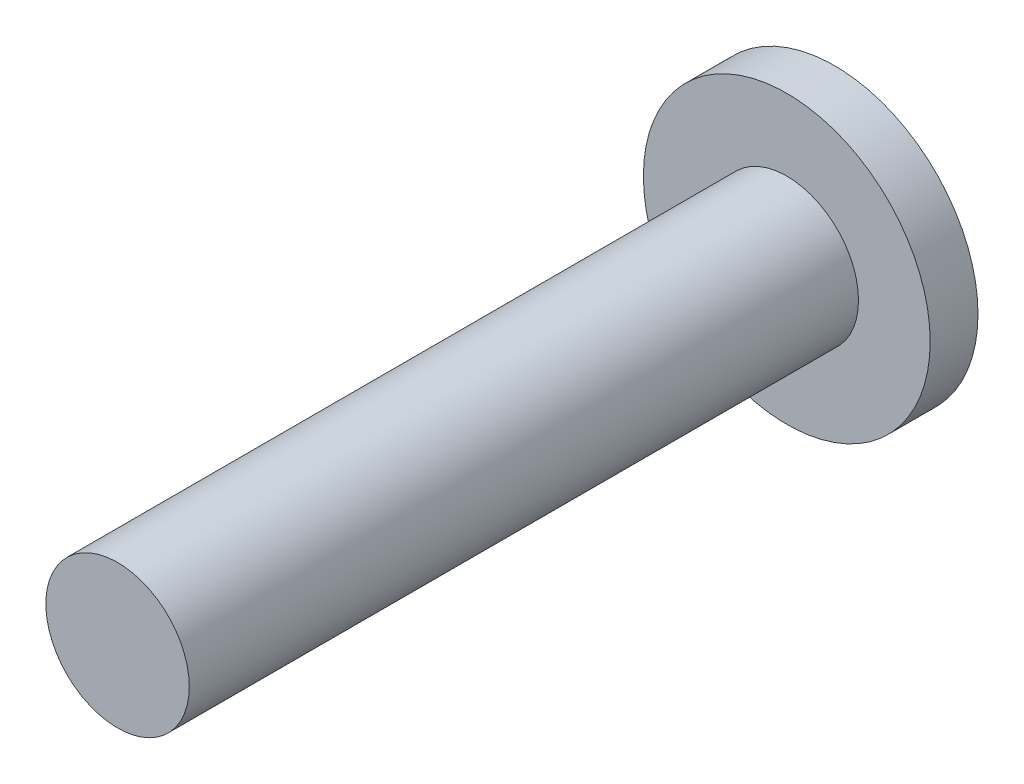
ISO-10303-21;
HEADER;
FILE_DESCRIPTION(('STEP AP214'),'2;1');
FILE_NAME('part.step','',(''),(''),'','','');
FILE_SCHEMA(('AUTOMOTIVE_DESIGN { 1 0 10303 214 1 1 1 1 }'));
ENDSEC;
DATA;
#1=APPLICATION_CONTEXT('core data for automotive mechanical design processes');
#2=APPLICATION_PROTOCOL_DEFINITION('international standard','automotive_design',2000,#1);
#3=PRODUCT_CONTEXT('',#1,'mechanical');
#4=PRODUCT('Part','Part','',(#3));
#5=PRODUCT_RELATED_PRODUCT_CATEGORY('part','',(#4));
#6=PRODUCT_DEFINITION_FORMATION('','',#4);
#7=PRODUCT_DEFINITION_CONTEXT('part definition',#1,'design');
#8=PRODUCT_DEFINITION('design','',#6,#7);
#9=PRODUCT_DEFINITION_SHAPE('','',#8);
#10=(LENGTH_UNIT() NAMED_UNIT(*) SI_UNIT(.MILLI.,.METRE.));
#11=(NAMED_UNIT(*) PLANE_ANGLE_UNIT() SI_UNIT($,.RADIAN.));
#12=(NAMED_UNIT(*) SI_UNIT($,.STERADIAN.) SOLID_ANGLE_UNIT());
#13=UNCERTAINTY_MEASURE_WITH_UNIT(LENGTH_MEASURE(1.E-05),#10,'distance_accuracy_value','');
#14=(GEOMETRIC_REPRESENTATION_CONTEXT(3) GLOBAL_UNCERTAINTY_ASSIGNED_CONTEXT((#13)) GLOBAL_UNIT_ASSIGNED_CONTEXT((#10,
#11,#12)) REPRESENTATION_CONTEXT('',''));
#15=CARTESIAN_POINT('',(0.,0.,0.));
#16=DIRECTION('',(0.,0.,1.));
#17=DIRECTION('',(1.,0.,0.));
#18=AXIS2_PLACEMENT_3D('',#15,#16,#17);
#19=CARTESIAN_POINT('',(0.,0.,1.));
#20=DIRECTION('',(0.,0.,-1.));
#21=DIRECTION('',(-1.,0.,0.));
#22=AXIS2_PLACEMENT_3D('',#19,#20,#21);
#23=CYLINDRICAL_SURFACE('',#22,3.);
#24=CARTESIAN_POINT('',(0.,0.,1.));
#25=DIRECTION('',(0.,0.,1.));
#26=DIRECTION('',(1.,0.,0.));
#27=AXIS2_PLACEMENT_3D('',#24,#25,#26);
#28=CIRCLE('',#27,3.);
#29=CARTESIAN_POINT('',(3.,0.,1.));
#30=VERTEX_POINT('',#29);
#31=EDGE_CURVE('E45',#30,#30,#28,.T.);
#32=ORIENTED_EDGE('',*,*,#31,.F.);
#33=EDGE_LOOP('',(#32));
#34=FACE_BOUND('',#33,.T.);
#35=CARTESIAN_POINT('',(0.,0.,0.));
#36=DIRECTION('',(0.,0.,1.));
#37=DIRECTION('',(1.,0.,0.));
#38=AXIS2_PLACEMENT_3D('',#35,#36,#37);
#39=CIRCLE('',#38,3.);
#40=CARTESIAN_POINT('',(3.,0.,0.));
#41=VERTEX_POINT('',#40);
#42=EDGE_CURVE('E40',#41,#41,#39,.T.);
#43=ORIENTED_EDGE('',*,*,#42,.T.);
#44=EDGE_LOOP('',(#43));
#45=FACE_BOUND('',#44,.T.);
#46=ADVANCED_FACE('F37',(#34,#45),#23,.T.);
#47=CARTESIAN_POINT('',(0.,0.,1.));
#48=DIRECTION('',(0.,0.,1.));
#49=DIRECTION('',(1.,0.,0.));
#50=AXIS2_PLACEMENT_3D('',#47,#48,#49);
#51=PLANE('',#50);
#52=CARTESIAN_POINT('',(0.,0.,1.));
#53=DIRECTION('',(0.,0.,1.));
#54=DIRECTION('',(1.,0.,0.));
#55=AXIS2_PLACEMENT_3D('',#52,#53,#54);
#56=CIRCLE('',#55,1.5);
#57=CARTESIAN_POINT('',(1.5,0.,1.));
#58=VERTEX_POINT('',#57);
#59=EDGE_CURVE('E10',#58,#58,#56,.T.);
#60=ORIENTED_EDGE('',*,*,#59,.F.);
#61=EDGE_LOOP('',(#60));
#62=FACE_BOUND('',#61,.T.);
#63=ORIENTED_EDGE('',*,*,#31,.T.);
#64=EDGE_LOOP('',(#63));
#65=FACE_BOUND('',#64,.T.);
#66=ADVANCED_FACE('F65',(#62,#65),#51,.T.);
#67=CARTESIAN_POINT('',(0.,0.,0.));
#68=DIRECTION('',(0.,0.,1.));
#69=DIRECTION('',(1.,0.,0.));
#70=AXIS2_PLACEMENT_3D('',#67,#68,#69);
#71=PLANE('',#70);
#72=ORIENTED_EDGE('',*,*,#42,.F.);
#73=EDGE_LOOP('',(#72));
#74=FACE_BOUND('',#73,.T.);
#75=ADVANCED_FACE('F62',(#74),#71,.F.);
#76=CARTESIAN_POINT('',(0.,0.,15.));
#77=DIRECTION('',(0.,0.,-1.));
#78=DIRECTION('',(-1.,0.,0.));
#79=AXIS2_PLACEMENT_3D('',#76,#77,#78);
#80=CYLINDRICAL_SURFACE('',#79,1.5);
#81=CARTESIAN_POINT('',(0.,0.,15.));
#82=DIRECTION('',(0.,0.,1.));
#83=DIRECTION('',(1.,0.,0.));
#84=AXIS2_PLACEMENT_3D('',#81,#82,#83);
#85=CIRCLE('',#84,1.5);
#86=CARTESIAN_POINT('',(1.5,0.,15.));
#87=VERTEX_POINT('',#86);
#88=EDGE_CURVE('E52',#87,#87,#85,.T.);
#89=ORIENTED_EDGE('',*,*,#88,.F.);
#90=EDGE_LOOP('',(#89));
#91=FACE_BOUND('',#90,.T.);
#92=ORIENTED_EDGE('',*,*,#59,.T.);
#93=EDGE_LOOP('',(#92));
#94=FACE_BOUND('',#93,.T.);
#95=ADVANCED_FACE('F64',(#91,#94),#80,.T.);
#96=CARTESIAN_POINT('',(0.,0.,15.));
#97=DIRECTION('',(0.,0.,1.));
#98=DIRECTION('',(1.,0.,0.));
#99=AXIS2_PLACEMENT_3D('',#96,#97,#98);
#100=PLANE('',#99);
#101=ORIENTED_EDGE('',*,*,#88,.T.);
#102=EDGE_LOOP('',(#101));
#103=FACE_BOUND('',#102,.T.);
#104=ADVANCED_FACE('F70',(#103),#100,.T.);
#105=CLOSED_SHELL('',(#46,#66,#75,#95,#104));
#106=MANIFOLD_SOLID_BREP('B2',#105);
#107=ADVANCED_BREP_SHAPE_REPRESENTATION('',(#18,#106),#14);
#108=SHAPE_DEFINITION_REPRESENTATION(#9,#107);
ENDSEC;
END-ISO-10303-21;
